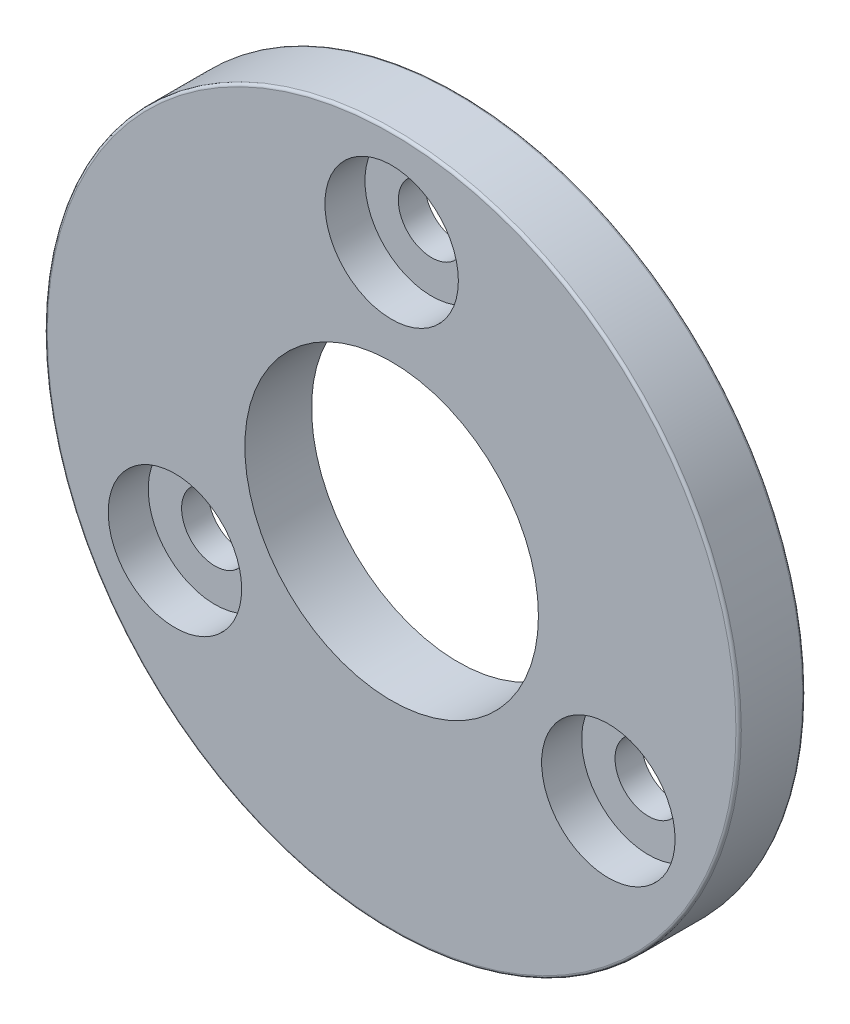
ISO-10303-21;
HEADER;
FILE_DESCRIPTION(('STEP AP214'),'2;1');
FILE_NAME('part.step','',(''),(''),'','','');
FILE_SCHEMA(('AUTOMOTIVE_DESIGN { 1 0 10303 214 1 1 1 1 }'));
ENDSEC;
DATA;
#1=APPLICATION_CONTEXT('core data for automotive mechanical design processes');
#2=APPLICATION_PROTOCOL_DEFINITION('international standard','automotive_design',2000,#1);
#3=PRODUCT_CONTEXT('',#1,'mechanical');
#4=PRODUCT('Part','Part','',(#3));
#5=PRODUCT_RELATED_PRODUCT_CATEGORY('part','',(#4));
#6=PRODUCT_DEFINITION_FORMATION('','',#4);
#7=PRODUCT_DEFINITION_CONTEXT('part definition',#1,'design');
#8=PRODUCT_DEFINITION('design','',#6,#7);
#9=PRODUCT_DEFINITION_SHAPE('','',#8);
#10=(LENGTH_UNIT() NAMED_UNIT(*) SI_UNIT(.MILLI.,.METRE.));
#11=(NAMED_UNIT(*) PLANE_ANGLE_UNIT() SI_UNIT($,.RADIAN.));
#12=(NAMED_UNIT(*) SI_UNIT($,.STERADIAN.) SOLID_ANGLE_UNIT());
#13=UNCERTAINTY_MEASURE_WITH_UNIT(LENGTH_MEASURE(1.E-05),#10,'distance_accuracy_value','');
#14=(GEOMETRIC_REPRESENTATION_CONTEXT(3) GLOBAL_UNCERTAINTY_ASSIGNED_CONTEXT((#13)) GLOBAL_UNIT_ASSIGNED_CONTEXT((#10,
#11,#12)) REPRESENTATION_CONTEXT('',''));
#15=CARTESIAN_POINT('',(0.,0.,0.));
#16=DIRECTION('',(0.,0.,1.));
#17=DIRECTION('',(1.,0.,0.));
#18=AXIS2_PLACEMENT_3D('',#15,#16,#17);
#19=CARTESIAN_POINT('',(0.,18.75,5.));
#20=DIRECTION('',(0.,0.,1.));
#21=DIRECTION('',(1.,0.,0.));
#22=AXIS2_PLACEMENT_3D('',#19,#20,#21);
#23=CYLINDRICAL_SURFACE('',#22,2.5);
#24=CARTESIAN_POINT('',(0.,18.75,0.));
#25=DIRECTION('',(0.,0.,1.));
#26=DIRECTION('',(1.,0.,0.));
#27=AXIS2_PLACEMENT_3D('',#24,#25,#26);
#28=CIRCLE('',#27,2.5);
#29=CARTESIAN_POINT('',(2.5,18.75,0.));
#30=VERTEX_POINT('',#29);
#31=EDGE_CURVE('E78',#30,#30,#28,.T.);
#32=ORIENTED_EDGE('',*,*,#31,.F.);
#33=EDGE_LOOP('',(#32));
#34=FACE_BOUND('',#33,.T.);
#35=CARTESIAN_POINT('',(0.,18.75,2.));
#36=DIRECTION('',(0.,0.,1.));
#37=DIRECTION('',(1.,0.,0.));
#38=AXIS2_PLACEMENT_3D('',#35,#36,#37);
#39=CIRCLE('',#38,2.5);
#40=CARTESIAN_POINT('',(2.5,18.75,2.));
#41=VERTEX_POINT('',#40);
#42=EDGE_CURVE('E41',#41,#41,#39,.F.);
#43=ORIENTED_EDGE('',*,*,#42,.F.);
#44=EDGE_LOOP('',(#43));
#45=FACE_BOUND('',#44,.T.);
#46=ADVANCED_FACE('F40',(#34,#45),#23,.F.);
#47=CARTESIAN_POINT('',(-16.2379763209582,-9.37500000000008,5.));
#48=DIRECTION('',(0.,0.,1.));
#49=DIRECTION('',(1.,0.,0.));
#50=AXIS2_PLACEMENT_3D('',#47,#48,#49);
#51=CYLINDRICAL_SURFACE('',#50,2.5);
#52=CARTESIAN_POINT('',(-16.2379763209582,-9.37500000000008,0.));
#53=DIRECTION('',(0.,0.,1.));
#54=DIRECTION('',(1.,0.,0.));
#55=AXIS2_PLACEMENT_3D('',#52,#53,#54);
#56=CIRCLE('',#55,2.5);
#57=CARTESIAN_POINT('',(-13.7379763209582,-9.37500000000008,0.));
#58=VERTEX_POINT('',#57);
#59=EDGE_CURVE('E80',#58,#58,#56,.T.);
#60=ORIENTED_EDGE('',*,*,#59,.F.);
#61=EDGE_LOOP('',(#60));
#62=FACE_BOUND('',#61,.T.);
#63=CARTESIAN_POINT('',(-16.2379763209582,-9.37500000000008,2.));
#64=DIRECTION('',(0.,0.,1.));
#65=DIRECTION('',(1.,0.,0.));
#66=AXIS2_PLACEMENT_3D('',#63,#64,#65);
#67=CIRCLE('',#66,2.5);
#68=CARTESIAN_POINT('',(-13.7379763209582,-9.37500000000008,2.));
#69=VERTEX_POINT('',#68);
#70=EDGE_CURVE('E57',#69,#69,#67,.F.);
#71=ORIENTED_EDGE('',*,*,#70,.F.);
#72=EDGE_LOOP('',(#71));
#73=FACE_BOUND('',#72,.T.);
#74=ADVANCED_FACE('F108',(#62,#73),#51,.F.);
#75=CARTESIAN_POINT('',(16.2379763209583,-9.37499999999985,5.));
#76=DIRECTION('',(0.,0.,1.));
#77=DIRECTION('',(1.,0.,0.));
#78=AXIS2_PLACEMENT_3D('',#75,#76,#77);
#79=CYLINDRICAL_SURFACE('',#78,2.5);
#80=CARTESIAN_POINT('',(16.2379763209583,-9.37499999999985,0.));
#81=DIRECTION('',(0.,0.,1.));
#82=DIRECTION('',(1.,0.,0.));
#83=AXIS2_PLACEMENT_3D('',#80,#81,#82);
#84=CIRCLE('',#83,2.5);
#85=CARTESIAN_POINT('',(18.7379763209583,-9.37499999999985,0.));
#86=VERTEX_POINT('',#85);
#87=EDGE_CURVE('E73',#86,#86,#84,.T.);
#88=ORIENTED_EDGE('',*,*,#87,.F.);
#89=EDGE_LOOP('',(#88));
#90=FACE_BOUND('',#89,.T.);
#91=CARTESIAN_POINT('',(16.2379763209583,-9.37499999999985,2.));
#92=DIRECTION('',(0.,0.,1.));
#93=DIRECTION('',(1.,0.,0.));
#94=AXIS2_PLACEMENT_3D('',#91,#92,#93);
#95=CIRCLE('',#94,2.5);
#96=CARTESIAN_POINT('',(18.7379763209583,-9.37499999999985,2.));
#97=VERTEX_POINT('',#96);
#98=EDGE_CURVE('E53',#97,#97,#95,.F.);
#99=ORIENTED_EDGE('',*,*,#98,.F.);
#100=EDGE_LOOP('',(#99));
#101=FACE_BOUND('',#100,.T.);
#102=ADVANCED_FACE('F112',(#90,#101),#79,.F.);
#103=CARTESIAN_POINT('',(0.,0.,5.));
#104=DIRECTION('',(0.,0.,-1.));
#105=DIRECTION('',(-1.,0.,0.));
#106=AXIS2_PLACEMENT_3D('',#103,#104,#105);
#107=CYLINDRICAL_SURFACE('',#106,26.);
#108=CARTESIAN_POINT('',(0.,0.,0.2));
#109=DIRECTION('',(0.,0.,1.));
#110=DIRECTION('',(1.,0.,0.));
#111=AXIS2_PLACEMENT_3D('',#108,#109,#110);
#112=CIRCLE('',#111,26.);
#113=CARTESIAN_POINT('',(26.,0.,0.2));
#114=VERTEX_POINT('',#113);
#115=EDGE_CURVE('E49',#114,#114,#112,.T.);
#116=ORIENTED_EDGE('',*,*,#115,.T.);
#117=EDGE_LOOP('',(#116));
#118=FACE_BOUND('',#117,.T.);
#119=CARTESIAN_POINT('',(0.,0.,4.8));
#120=DIRECTION('',(0.,0.,1.));
#121=DIRECTION('',(1.,0.,0.));
#122=AXIS2_PLACEMENT_3D('',#119,#120,#121);
#123=CIRCLE('',#122,26.);
#124=CARTESIAN_POINT('',(26.,0.,4.8));
#125=VERTEX_POINT('',#124);
#126=EDGE_CURVE('E84',#125,#125,#123,.F.);
#127=ORIENTED_EDGE('',*,*,#126,.T.);
#128=EDGE_LOOP('',(#127));
#129=FACE_BOUND('',#128,.T.);
#130=ADVANCED_FACE('F87',(#118,#129),#107,.T.);
#131=CARTESIAN_POINT('',(0.,0.,5.));
#132=DIRECTION('',(0.,0.,1.));
#133=DIRECTION('',(1.,0.,0.));
#134=AXIS2_PLACEMENT_3D('',#131,#132,#133);
#135=PLANE('',#134);
#136=CARTESIAN_POINT('',(0.,18.75,5.));
#137=DIRECTION('',(0.,0.,1.));
#138=DIRECTION('',(1.,0.,0.));
#139=AXIS2_PLACEMENT_3D('',#136,#137,#138);
#140=CIRCLE('',#139,5.);
#141=CARTESIAN_POINT('',(5.,18.75,5.));
#142=VERTEX_POINT('',#141);
#143=EDGE_CURVE('E162',#142,#142,#140,.T.);
#144=ORIENTED_EDGE('',*,*,#143,.F.);
#145=EDGE_LOOP('',(#144));
#146=FACE_BOUND('',#145,.T.);
#147=CARTESIAN_POINT('',(-16.2379763209582,-9.37500000000008,5.));
#148=DIRECTION('',(0.,0.,1.));
#149=DIRECTION('',(1.,0.,0.));
#150=AXIS2_PLACEMENT_3D('',#147,#148,#149);
#151=CIRCLE('',#150,5.);
#152=CARTESIAN_POINT('',(-11.2379763209582,-9.37500000000008,5.));
#153=VERTEX_POINT('',#152);
#154=EDGE_CURVE('E164',#153,#153,#151,.T.);
#155=ORIENTED_EDGE('',*,*,#154,.F.);
#156=EDGE_LOOP('',(#155));
#157=FACE_BOUND('',#156,.T.);
#158=CARTESIAN_POINT('',(16.2379763209583,-9.37499999999985,5.));
#159=DIRECTION('',(0.,0.,1.));
#160=DIRECTION('',(1.,0.,0.));
#161=AXIS2_PLACEMENT_3D('',#158,#159,#160);
#162=CIRCLE('',#161,5.);
#163=CARTESIAN_POINT('',(21.2379763209583,-9.37499999999985,5.));
#164=VERTEX_POINT('',#163);
#165=EDGE_CURVE('E173',#164,#164,#162,.T.);
#166=ORIENTED_EDGE('',*,*,#165,.F.);
#167=EDGE_LOOP('',(#166));
#168=FACE_BOUND('',#167,.T.);
#169=CARTESIAN_POINT('',(0.,0.,5.));
#170=DIRECTION('',(0.,0.,1.));
#171=DIRECTION('',(1.,0.,0.));
#172=AXIS2_PLACEMENT_3D('',#169,#170,#171);
#173=CIRCLE('',#172,25.8);
#174=CARTESIAN_POINT('',(25.8,0.,5.));
#175=VERTEX_POINT('',#174);
#176=EDGE_CURVE('E10',#175,#175,#173,.T.);
#177=ORIENTED_EDGE('',*,*,#176,.T.);
#178=EDGE_LOOP('',(#177));
#179=FACE_BOUND('',#178,.T.);
#180=CARTESIAN_POINT('',(0.,0.,5.));
#181=DIRECTION('',(0.,0.,1.));
#182=DIRECTION('',(1.,0.,0.));
#183=AXIS2_PLACEMENT_3D('',#180,#181,#182);
#184=CIRCLE('',#183,11.);
#185=CARTESIAN_POINT('',(11.,0.,5.));
#186=VERTEX_POINT('',#185);
#187=EDGE_CURVE('E65',#186,#186,#184,.T.);
#188=ORIENTED_EDGE('',*,*,#187,.F.);
#189=EDGE_LOOP('',(#188));
#190=FACE_BOUND('',#189,.T.);
#191=ADVANCED_FACE('F122',(#146,#157,#168,#179,#190),#135,.T.);
#192=CARTESIAN_POINT('',(0.,0.,0.));
#193=DIRECTION('',(0.,0.,1.));
#194=DIRECTION('',(1.,0.,0.));
#195=AXIS2_PLACEMENT_3D('',#192,#193,#194);
#196=PLANE('',#195);
#197=CARTESIAN_POINT('',(0.,0.,0.));
#198=DIRECTION('',(0.,0.,1.));
#199=DIRECTION('',(1.,0.,0.));
#200=AXIS2_PLACEMENT_3D('',#197,#198,#199);
#201=CIRCLE('',#200,25.8);
#202=CARTESIAN_POINT('',(25.8,0.,0.));
#203=VERTEX_POINT('',#202);
#204=EDGE_CURVE('E44',#203,#203,#201,.F.);
#205=ORIENTED_EDGE('',*,*,#204,.T.);
#206=EDGE_LOOP('',(#205));
#207=FACE_BOUND('',#206,.T.);
#208=CARTESIAN_POINT('',(0.,0.,0.));
#209=DIRECTION('',(0.,0.,1.));
#210=DIRECTION('',(1.,0.,0.));
#211=AXIS2_PLACEMENT_3D('',#208,#209,#210);
#212=CIRCLE('',#211,11.);
#213=CARTESIAN_POINT('',(11.,0.,0.));
#214=VERTEX_POINT('',#213);
#215=EDGE_CURVE('E66',#214,#214,#212,.T.);
#216=ORIENTED_EDGE('',*,*,#215,.T.);
#217=EDGE_LOOP('',(#216));
#218=FACE_BOUND('',#217,.T.);
#219=ORIENTED_EDGE('',*,*,#87,.T.);
#220=EDGE_LOOP('',(#219));
#221=FACE_BOUND('',#220,.T.);
#222=ORIENTED_EDGE('',*,*,#59,.T.);
#223=EDGE_LOOP('',(#222));
#224=FACE_BOUND('',#223,.T.);
#225=ORIENTED_EDGE('',*,*,#31,.T.);
#226=EDGE_LOOP('',(#225));
#227=FACE_BOUND('',#226,.T.);
#228=ADVANCED_FACE('F105',(#207,#218,#221,#224,#227),#196,.F.);
#229=CARTESIAN_POINT('',(0.,0.,0.));
#230=DIRECTION('',(0.,0.,1.));
#231=DIRECTION('',(1.,0.,0.));
#232=AXIS2_PLACEMENT_3D('',#229,#230,#231);
#233=CYLINDRICAL_SURFACE('',#232,11.);
#234=ORIENTED_EDGE('',*,*,#215,.F.);
#235=EDGE_LOOP('',(#234));
#236=FACE_BOUND('',#235,.T.);
#237=ORIENTED_EDGE('',*,*,#187,.T.);
#238=EDGE_LOOP('',(#237));
#239=FACE_BOUND('',#238,.T.);
#240=ADVANCED_FACE('F92',(#236,#239),#233,.F.);
#241=CARTESIAN_POINT('',(0.,0.,0.2));
#242=DIRECTION('',(0.,0.,1.));
#243=DIRECTION('',(1.,0.,0.));
#244=AXIS2_PLACEMENT_3D('',#241,#242,#243);
#245=TOROIDAL_SURFACE('',#244,25.8,0.2);
#246=ORIENTED_EDGE('',*,*,#204,.F.);
#247=EDGE_LOOP('',(#246));
#248=FACE_BOUND('',#247,.T.);
#249=ORIENTED_EDGE('',*,*,#115,.F.);
#250=EDGE_LOOP('',(#249));
#251=FACE_BOUND('',#250,.T.);
#252=ADVANCED_FACE('F93',(#248,#251),#245,.T.);
#253=CARTESIAN_POINT('',(0.,0.,4.8));
#254=DIRECTION('',(0.,0.,1.));
#255=DIRECTION('',(1.,0.,0.));
#256=AXIS2_PLACEMENT_3D('',#253,#254,#255);
#257=TOROIDAL_SURFACE('',#256,25.8,0.2);
#258=ORIENTED_EDGE('',*,*,#126,.F.);
#259=EDGE_LOOP('',(#258));
#260=FACE_BOUND('',#259,.T.);
#261=ORIENTED_EDGE('',*,*,#176,.F.);
#262=EDGE_LOOP('',(#261));
#263=FACE_BOUND('',#262,.T.);
#264=ADVANCED_FACE('F39',(#260,#263),#257,.T.);
#265=CARTESIAN_POINT('',(16.2379763209583,-9.37499999999985,2.));
#266=DIRECTION('',(0.,0.,1.));
#267=DIRECTION('',(1.,0.,0.));
#268=AXIS2_PLACEMENT_3D('',#265,#266,#267);
#269=PLANE('',#268);
#270=CARTESIAN_POINT('',(16.2379763209583,-9.37499999999985,2.));
#271=DIRECTION('',(0.,0.,1.));
#272=DIRECTION('',(1.,0.,0.));
#273=AXIS2_PLACEMENT_3D('',#270,#271,#272);
#274=CIRCLE('',#273,5.);
#275=CARTESIAN_POINT('',(21.2379763209583,-9.37499999999985,2.));
#276=VERTEX_POINT('',#275);
#277=EDGE_CURVE('E174',#276,#276,#274,.T.);
#278=ORIENTED_EDGE('',*,*,#277,.T.);
#279=EDGE_LOOP('',(#278));
#280=FACE_BOUND('',#279,.T.);
#281=ORIENTED_EDGE('',*,*,#98,.T.);
#282=EDGE_LOOP('',(#281));
#283=FACE_BOUND('',#282,.T.);
#284=ADVANCED_FACE('F100',(#280,#283),#269,.T.);
#285=CARTESIAN_POINT('',(16.2379763209583,-9.37499999999985,2.));
#286=DIRECTION('',(0.,0.,1.));
#287=DIRECTION('',(1.,0.,0.));
#288=AXIS2_PLACEMENT_3D('',#285,#286,#287);
#289=CYLINDRICAL_SURFACE('',#288,5.);
#290=ORIENTED_EDGE('',*,*,#277,.F.);
#291=EDGE_LOOP('',(#290));
#292=FACE_BOUND('',#291,.T.);
#293=ORIENTED_EDGE('',*,*,#165,.T.);
#294=EDGE_LOOP('',(#293));
#295=FACE_BOUND('',#294,.T.);
#296=ADVANCED_FACE('F137',(#292,#295),#289,.F.);
#297=CARTESIAN_POINT('',(-16.2379763209582,-9.37500000000008,2.));
#298=DIRECTION('',(0.,0.,1.));
#299=DIRECTION('',(1.,0.,0.));
#300=AXIS2_PLACEMENT_3D('',#297,#298,#299);
#301=PLANE('',#300);
#302=CARTESIAN_POINT('',(-16.2379763209582,-9.37500000000008,2.));
#303=DIRECTION('',(0.,0.,1.));
#304=DIRECTION('',(1.,0.,0.));
#305=AXIS2_PLACEMENT_3D('',#302,#303,#304);
#306=CIRCLE('',#305,5.);
#307=CARTESIAN_POINT('',(-11.2379763209582,-9.37500000000008,2.));
#308=VERTEX_POINT('',#307);
#309=EDGE_CURVE('E167',#308,#308,#306,.T.);
#310=ORIENTED_EDGE('',*,*,#309,.T.);
#311=EDGE_LOOP('',(#310));
#312=FACE_BOUND('',#311,.T.);
#313=ORIENTED_EDGE('',*,*,#70,.T.);
#314=EDGE_LOOP('',(#313));
#315=FACE_BOUND('',#314,.T.);
#316=ADVANCED_FACE('F145',(#312,#315),#301,.T.);
#317=CARTESIAN_POINT('',(-16.2379763209582,-9.37500000000008,2.));
#318=DIRECTION('',(0.,0.,1.));
#319=DIRECTION('',(1.,0.,0.));
#320=AXIS2_PLACEMENT_3D('',#317,#318,#319);
#321=CYLINDRICAL_SURFACE('',#320,5.);
#322=ORIENTED_EDGE('',*,*,#309,.F.);
#323=EDGE_LOOP('',(#322));
#324=FACE_BOUND('',#323,.T.);
#325=ORIENTED_EDGE('',*,*,#154,.T.);
#326=EDGE_LOOP('',(#325));
#327=FACE_BOUND('',#326,.T.);
#328=ADVANCED_FACE('F147',(#324,#327),#321,.F.);
#329=CARTESIAN_POINT('',(0.,18.75,2.));
#330=DIRECTION('',(0.,0.,1.));
#331=DIRECTION('',(1.,0.,0.));
#332=AXIS2_PLACEMENT_3D('',#329,#330,#331);
#333=PLANE('',#332);
#334=CARTESIAN_POINT('',(0.,18.75,2.));
#335=DIRECTION('',(0.,0.,1.));
#336=DIRECTION('',(1.,0.,0.));
#337=AXIS2_PLACEMENT_3D('',#334,#335,#336);
#338=CIRCLE('',#337,5.);
#339=CARTESIAN_POINT('',(5.,18.75,2.));
#340=VERTEX_POINT('',#339);
#341=EDGE_CURVE('E60',#340,#340,#338,.T.);
#342=ORIENTED_EDGE('',*,*,#341,.T.);
#343=EDGE_LOOP('',(#342));
#344=FACE_BOUND('',#343,.T.);
#345=ORIENTED_EDGE('',*,*,#42,.T.);
#346=EDGE_LOOP('',(#345));
#347=FACE_BOUND('',#346,.T.);
#348=ADVANCED_FACE('F148',(#344,#347),#333,.T.);
#349=CARTESIAN_POINT('',(0.,18.75,2.));
#350=DIRECTION('',(0.,0.,1.));
#351=DIRECTION('',(1.,0.,0.));
#352=AXIS2_PLACEMENT_3D('',#349,#350,#351);
#353=CYLINDRICAL_SURFACE('',#352,5.);
#354=ORIENTED_EDGE('',*,*,#341,.F.);
#355=EDGE_LOOP('',(#354));
#356=FACE_BOUND('',#355,.T.);
#357=ORIENTED_EDGE('',*,*,#143,.T.);
#358=EDGE_LOOP('',(#357));
#359=FACE_BOUND('',#358,.T.);
#360=ADVANCED_FACE('F155',(#356,#359),#353,.F.);
#361=CLOSED_SHELL('',(#46,#74,#102,#130,#191,#228,#240,#252,#264,#284,#296,#316,#328,#348,#360));
#362=MANIFOLD_SOLID_BREP('B2',#361);
#363=ADVANCED_BREP_SHAPE_REPRESENTATION('',(#18,#362),#14);
#364=SHAPE_DEFINITION_REPRESENTATION(#9,#363);
ENDSEC;
END-ISO-10303-21;
